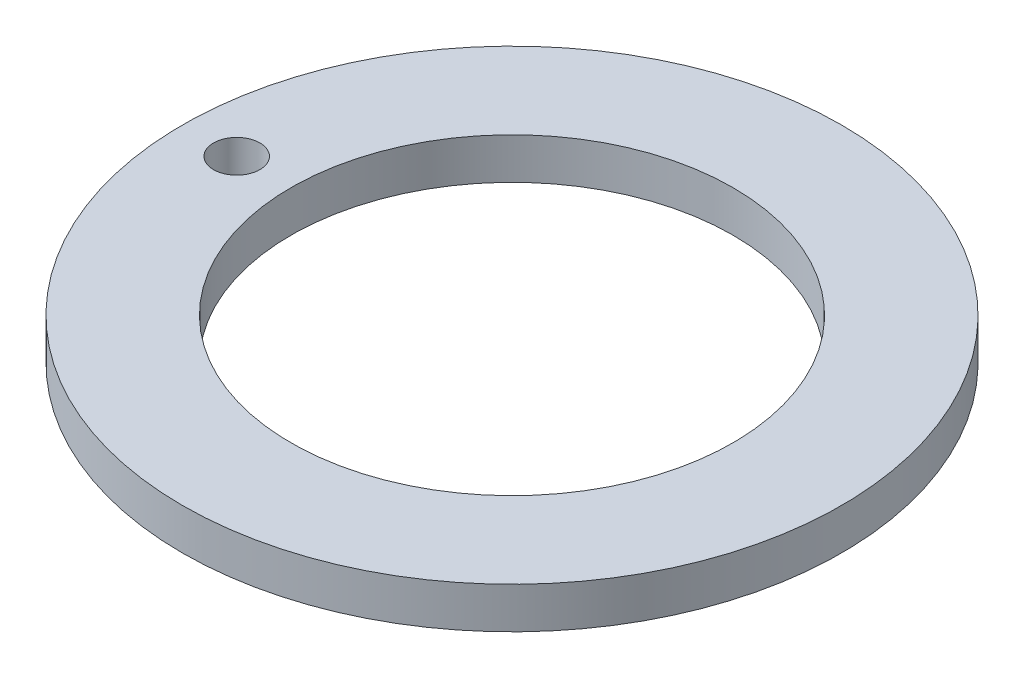
ISO-10303-21;
HEADER;
FILE_DESCRIPTION(('STEP AP214'),'2;1');
FILE_NAME('part.step','',(''),(''),'','','');
FILE_SCHEMA(('AUTOMOTIVE_DESIGN { 1 0 10303 214 1 1 1 1 }'));
ENDSEC;
DATA;
#1=APPLICATION_CONTEXT('core data for automotive mechanical design processes');
#2=APPLICATION_PROTOCOL_DEFINITION('international standard','automotive_design',2000,#1);
#3=PRODUCT_CONTEXT('',#1,'mechanical');
#4=PRODUCT('Part','Part','',(#3));
#5=PRODUCT_RELATED_PRODUCT_CATEGORY('part','',(#4));
#6=PRODUCT_DEFINITION_FORMATION('','',#4);
#7=PRODUCT_DEFINITION_CONTEXT('part definition',#1,'design');
#8=PRODUCT_DEFINITION('design','',#6,#7);
#9=PRODUCT_DEFINITION_SHAPE('','',#8);
#10=(LENGTH_UNIT() NAMED_UNIT(*) SI_UNIT(.MILLI.,.METRE.));
#11=(NAMED_UNIT(*) PLANE_ANGLE_UNIT() SI_UNIT($,.RADIAN.));
#12=(NAMED_UNIT(*) SI_UNIT($,.STERADIAN.) SOLID_ANGLE_UNIT());
#13=UNCERTAINTY_MEASURE_WITH_UNIT(LENGTH_MEASURE(1.E-05),#10,'distance_accuracy_value','');
#14=(GEOMETRIC_REPRESENTATION_CONTEXT(3) GLOBAL_UNCERTAINTY_ASSIGNED_CONTEXT((#13)) GLOBAL_UNIT_ASSIGNED_CONTEXT((#10,
#11,#12)) REPRESENTATION_CONTEXT('',''));
#15=CARTESIAN_POINT('',(0.,0.,0.));
#16=DIRECTION('',(0.,0.,1.));
#17=DIRECTION('',(1.,0.,0.));
#18=AXIS2_PLACEMENT_3D('',#15,#16,#17);
#19=CARTESIAN_POINT('',(0.,9.525,0.));
#20=DIRECTION('',(0.,1.,0.));
#21=DIRECTION('',(0.,0.,1.));
#22=AXIS2_PLACEMENT_3D('',#19,#20,#21);
#23=PLANE('',#22);
#24=CARTESIAN_POINT('',(-63.6524,9.525,0.));
#25=DIRECTION('',(0.,1.,0.));
#26=DIRECTION('',(0.,0.,1.));
#27=AXIS2_PLACEMENT_3D('',#24,#25,#26);
#28=CIRCLE('',#27,5.35813000000001);
#29=CARTESIAN_POINT('',(-63.6524,9.525,5.35813000000001));
#30=VERTEX_POINT('',#29);
#31=EDGE_CURVE('E62',#30,#30,#28,.T.);
#32=ORIENTED_EDGE('',*,*,#31,.F.);
#33=EDGE_LOOP('',(#32));
#34=FACE_BOUND('',#33,.T.);
#35=CARTESIAN_POINT('',(0.,9.525,0.));
#36=DIRECTION('',(0.,1.,0.));
#37=DIRECTION('',(0.,0.,1.));
#38=AXIS2_PLACEMENT_3D('',#35,#36,#37);
#39=CIRCLE('',#38,76.2);
#40=CARTESIAN_POINT('',(0.,9.525,-76.2));
#41=VERTEX_POINT('',#40);
#42=EDGE_CURVE('E10',#41,#41,#39,.T.);
#43=ORIENTED_EDGE('',*,*,#42,.T.);
#44=EDGE_LOOP('',(#43));
#45=FACE_BOUND('',#44,.T.);
#46=CARTESIAN_POINT('',(0.,9.525,0.));
#47=DIRECTION('',(0.,1.,0.));
#48=DIRECTION('',(0.,0.,1.));
#49=AXIS2_PLACEMENT_3D('',#46,#47,#48);
#50=CIRCLE('',#49,51.1048);
#51=CARTESIAN_POINT('',(0.,9.525,-51.1048));
#52=VERTEX_POINT('',#51);
#53=EDGE_CURVE('E54',#52,#52,#50,.T.);
#54=ORIENTED_EDGE('',*,*,#53,.F.);
#55=EDGE_LOOP('',(#54));
#56=FACE_BOUND('',#55,.T.);
#57=ADVANCED_FACE('F43',(#34,#45,#56),#23,.T.);
#58=CARTESIAN_POINT('',(0.,0.,0.));
#59=DIRECTION('',(0.,1.,0.));
#60=DIRECTION('',(0.,0.,1.));
#61=AXIS2_PLACEMENT_3D('',#58,#59,#60);
#62=PLANE('',#61);
#63=CARTESIAN_POINT('',(-63.6524,0.,0.));
#64=DIRECTION('',(0.,1.,0.));
#65=DIRECTION('',(0.,0.,1.));
#66=AXIS2_PLACEMENT_3D('',#63,#64,#65);
#67=CIRCLE('',#66,5.35813000000001);
#68=CARTESIAN_POINT('',(-63.6524,0.,5.35813000000001));
#69=VERTEX_POINT('',#68);
#70=EDGE_CURVE('E59',#69,#69,#67,.T.);
#71=ORIENTED_EDGE('',*,*,#70,.T.);
#72=EDGE_LOOP('',(#71));
#73=FACE_BOUND('',#72,.T.);
#74=CARTESIAN_POINT('',(0.,0.,0.));
#75=DIRECTION('',(0.,1.,0.));
#76=DIRECTION('',(0.,0.,1.));
#77=AXIS2_PLACEMENT_3D('',#74,#75,#76);
#78=CIRCLE('',#77,76.2);
#79=CARTESIAN_POINT('',(0.,0.,-76.2));
#80=VERTEX_POINT('',#79);
#81=EDGE_CURVE('E47',#80,#80,#78,.T.);
#82=ORIENTED_EDGE('',*,*,#81,.F.);
#83=EDGE_LOOP('',(#82));
#84=FACE_BOUND('',#83,.T.);
#85=CARTESIAN_POINT('',(0.,0.,0.));
#86=DIRECTION('',(0.,1.,0.));
#87=DIRECTION('',(0.,0.,1.));
#88=AXIS2_PLACEMENT_3D('',#85,#86,#87);
#89=CIRCLE('',#88,51.1048);
#90=CARTESIAN_POINT('',(0.,0.,-51.1048));
#91=VERTEX_POINT('',#90);
#92=EDGE_CURVE('E56',#91,#91,#89,.T.);
#93=ORIENTED_EDGE('',*,*,#92,.T.);
#94=EDGE_LOOP('',(#93));
#95=FACE_BOUND('',#94,.T.);
#96=ADVANCED_FACE('F68',(#73,#84,#95),#62,.F.);
#97=CARTESIAN_POINT('',(0.,9.525,0.));
#98=DIRECTION('',(0.,-1.,0.));
#99=DIRECTION('',(0.,0.,-1.));
#100=AXIS2_PLACEMENT_3D('',#97,#98,#99);
#101=CYLINDRICAL_SURFACE('',#100,76.2);
#102=CARTESIAN_POINT('',(0.,9.525,-76.2));
#103=CARTESIAN_POINT('',(0.,9.42578125,-76.2));
#104=CARTESIAN_POINT('',(0.,9.3265625,-76.2));
#105=CARTESIAN_POINT('',(0.,9.128125,-76.2));
#106=CARTESIAN_POINT('',(0.,9.02890625,-76.2));
#107=CARTESIAN_POINT('',(0.,8.83046875,-76.2));
#108=CARTESIAN_POINT('',(0.,8.73125,-76.2));
#109=CARTESIAN_POINT('',(0.,8.5328125,-76.2));
#110=CARTESIAN_POINT('',(0.,8.43359375,-76.2));
#111=CARTESIAN_POINT('',(0.,8.23515625,-76.2));
#112=CARTESIAN_POINT('',(0.,8.1359375,-76.2));
#113=CARTESIAN_POINT('',(0.,7.9375,-76.2));
#114=CARTESIAN_POINT('',(0.,7.83828125,-76.2));
#115=CARTESIAN_POINT('',(0.,7.63984375,-76.2));
#116=CARTESIAN_POINT('',(0.,7.540625,-76.2));
#117=CARTESIAN_POINT('',(0.,7.3421875,-76.2));
#118=CARTESIAN_POINT('',(0.,7.24296875,-76.2));
#119=CARTESIAN_POINT('',(0.,7.04453125,-76.2));
#120=CARTESIAN_POINT('',(0.,6.9453125,-76.2));
#121=CARTESIAN_POINT('',(0.,6.746875,-76.2));
#122=CARTESIAN_POINT('',(0.,6.64765625,-76.2));
#123=CARTESIAN_POINT('',(0.,6.44921875,-76.2));
#124=CARTESIAN_POINT('',(0.,6.35,-76.2));
#125=CARTESIAN_POINT('',(0.,6.1515625,-76.2));
#126=CARTESIAN_POINT('',(0.,6.05234375,-76.2));
#127=CARTESIAN_POINT('',(0.,5.85390625,-76.2));
#128=CARTESIAN_POINT('',(0.,5.7546875,-76.2));
#129=CARTESIAN_POINT('',(0.,5.55625,-76.2));
#130=CARTESIAN_POINT('',(0.,5.45703125,-76.2));
#131=CARTESIAN_POINT('',(0.,5.25859375,-76.2));
#132=CARTESIAN_POINT('',(0.,5.159375,-76.2));
#133=CARTESIAN_POINT('',(0.,4.9609375,-76.2));
#134=CARTESIAN_POINT('',(0.,4.86171875,-76.2));
#135=CARTESIAN_POINT('',(0.,4.66328125,-76.2));
#136=CARTESIAN_POINT('',(0.,4.5640625,-76.2));
#137=CARTESIAN_POINT('',(0.,4.365625,-76.2));
#138=CARTESIAN_POINT('',(0.,4.26640625,-76.2));
#139=CARTESIAN_POINT('',(0.,4.06796875,-76.2));
#140=CARTESIAN_POINT('',(0.,3.96875,-76.2));
#141=CARTESIAN_POINT('',(0.,3.7703125,-76.2));
#142=CARTESIAN_POINT('',(0.,3.67109375,-76.2));
#143=CARTESIAN_POINT('',(0.,3.47265625,-76.2));
#144=CARTESIAN_POINT('',(0.,3.3734375,-76.2));
#145=CARTESIAN_POINT('',(0.,3.175,-76.2));
#146=CARTESIAN_POINT('',(0.,3.07578125,-76.2));
#147=CARTESIAN_POINT('',(0.,2.87734375,-76.2));
#148=CARTESIAN_POINT('',(0.,2.778125,-76.2));
#149=CARTESIAN_POINT('',(0.,2.5796875,-76.2));
#150=CARTESIAN_POINT('',(0.,2.48046875,-76.2));
#151=CARTESIAN_POINT('',(0.,2.28203125,-76.2));
#152=CARTESIAN_POINT('',(0.,2.1828125,-76.2));
#153=CARTESIAN_POINT('',(0.,1.984375,-76.2));
#154=CARTESIAN_POINT('',(0.,1.88515625,-76.2));
#155=CARTESIAN_POINT('',(0.,1.68671875,-76.2));
#156=CARTESIAN_POINT('',(0.,1.5875,-76.2));
#157=CARTESIAN_POINT('',(0.,1.3890625,-76.2));
#158=CARTESIAN_POINT('',(0.,1.28984375,-76.2));
#159=CARTESIAN_POINT('',(0.,1.09140625,-76.2));
#160=CARTESIAN_POINT('',(0.,0.992187500000001,-76.2));
#161=CARTESIAN_POINT('',(0.,0.793750000000001,-76.2));
#162=CARTESIAN_POINT('',(0.,0.69453125,-76.2));
#163=CARTESIAN_POINT('',(0.,0.49609375,-76.2));
#164=CARTESIAN_POINT('',(0.,0.396875,-76.2));
#165=CARTESIAN_POINT('',(0.,0.1984375,-76.2));
#166=CARTESIAN_POINT('',(0.,0.0992187500000001,-76.2));
#167=CARTESIAN_POINT('',(0.,0.,-76.2));
#168=B_SPLINE_CURVE_WITH_KNOTS('',3,(#102,#103,#104,#105,#106,#107,#108,#109,#110,#111,#112,
#113,#114,#115,#116,#117,#118,#119,#120,#121,#122,#123,#124,#125,#126,#127,#128,#129,#130,#131,
#132,#133,#134,#135,#136,#137,#138,#139,#140,#141,#142,#143,#144,#145,#146,#147,#148,#149,#150,
#151,#152,#153,#154,#155,#156,#157,#158,#159,#160,#161,#162,#163,#164,#165,#166,#167),
.UNSPECIFIED.,.F.,.F.,(4,2,2,2,2,2,2,2,2,2,2,2,2,2,2,2,2,2,2,2,2,2,2,2,2,2,2,2,2,2,2,2,4),(0.,
0.29765625,0.5953125,0.892968750000001,1.190625,1.48828125,1.7859375,2.08359375,2.38125,
2.67890625,2.9765625,3.27421875,3.571875,3.86953125,4.1671875,4.46484375,4.7625,5.06015625,
5.3578125,5.65546875,5.953125,6.25078125,6.5484375,6.84609375,7.14375,7.44140625,7.7390625,
8.03671875,8.334375,8.63203125,8.9296875,9.22734375,9.525),.UNSPECIFIED.);
#169=EDGE_CURVE('BSEAM45',#41,#80,#168,.T.);
#170=ORIENTED_EDGE('',*,*,#42,.F.);
#171=ORIENTED_EDGE('',*,*,#81,.T.);
#172=ORIENTED_EDGE('',*,*,#169,.T.);
#173=ORIENTED_EDGE('',*,*,#169,.F.);
#174=EDGE_LOOP('',(#170,#172,#171,#173));
#175=FACE_BOUND('',#174,.T.);
#176=ADVANCED_FACE('F45',(#175),#101,.T.);
#177=CARTESIAN_POINT('',(0.,9.525,0.));
#178=DIRECTION('',(0.,-1.,0.));
#179=DIRECTION('',(0.,0.,-1.));
#180=AXIS2_PLACEMENT_3D('',#177,#178,#179);
#181=CYLINDRICAL_SURFACE('',#180,51.1048);
#182=CARTESIAN_POINT('',(0.,9.525,-51.1048));
#183=CARTESIAN_POINT('',(0.,9.42578125,-51.1048));
#184=CARTESIAN_POINT('',(0.,9.3265625,-51.1048));
#185=CARTESIAN_POINT('',(0.,9.128125,-51.1048));
#186=CARTESIAN_POINT('',(0.,9.02890625,-51.1048));
#187=CARTESIAN_POINT('',(0.,8.83046875,-51.1048));
#188=CARTESIAN_POINT('',(0.,8.73125,-51.1048));
#189=CARTESIAN_POINT('',(0.,8.5328125,-51.1048));
#190=CARTESIAN_POINT('',(0.,8.43359375,-51.1048));
#191=CARTESIAN_POINT('',(0.,8.23515625,-51.1048));
#192=CARTESIAN_POINT('',(0.,8.1359375,-51.1048));
#193=CARTESIAN_POINT('',(0.,7.9375,-51.1048));
#194=CARTESIAN_POINT('',(0.,7.83828125,-51.1048));
#195=CARTESIAN_POINT('',(0.,7.63984375,-51.1048));
#196=CARTESIAN_POINT('',(0.,7.540625,-51.1048));
#197=CARTESIAN_POINT('',(0.,7.3421875,-51.1048));
#198=CARTESIAN_POINT('',(0.,7.24296875,-51.1048));
#199=CARTESIAN_POINT('',(0.,7.04453125,-51.1048));
#200=CARTESIAN_POINT('',(0.,6.9453125,-51.1048));
#201=CARTESIAN_POINT('',(0.,6.746875,-51.1048));
#202=CARTESIAN_POINT('',(0.,6.64765625,-51.1048));
#203=CARTESIAN_POINT('',(0.,6.44921875,-51.1048));
#204=CARTESIAN_POINT('',(0.,6.35,-51.1048));
#205=CARTESIAN_POINT('',(0.,6.1515625,-51.1048));
#206=CARTESIAN_POINT('',(0.,6.05234375,-51.1048));
#207=CARTESIAN_POINT('',(0.,5.85390625,-51.1048));
#208=CARTESIAN_POINT('',(0.,5.7546875,-51.1048));
#209=CARTESIAN_POINT('',(0.,5.55625,-51.1048));
#210=CARTESIAN_POINT('',(0.,5.45703125,-51.1048));
#211=CARTESIAN_POINT('',(0.,5.25859375,-51.1048));
#212=CARTESIAN_POINT('',(0.,5.159375,-51.1048));
#213=CARTESIAN_POINT('',(0.,4.9609375,-51.1048));
#214=CARTESIAN_POINT('',(0.,4.86171875,-51.1048));
#215=CARTESIAN_POINT('',(0.,4.66328125,-51.1048));
#216=CARTESIAN_POINT('',(0.,4.5640625,-51.1048));
#217=CARTESIAN_POINT('',(0.,4.365625,-51.1048));
#218=CARTESIAN_POINT('',(0.,4.26640625,-51.1048));
#219=CARTESIAN_POINT('',(0.,4.06796875,-51.1048));
#220=CARTESIAN_POINT('',(0.,3.96875,-51.1048));
#221=CARTESIAN_POINT('',(0.,3.7703125,-51.1048));
#222=CARTESIAN_POINT('',(0.,3.67109375,-51.1048));
#223=CARTESIAN_POINT('',(0.,3.47265625,-51.1048));
#224=CARTESIAN_POINT('',(0.,3.3734375,-51.1048));
#225=CARTESIAN_POINT('',(0.,3.175,-51.1048));
#226=CARTESIAN_POINT('',(0.,3.07578125,-51.1048));
#227=CARTESIAN_POINT('',(0.,2.87734375,-51.1048));
#228=CARTESIAN_POINT('',(0.,2.778125,-51.1048));
#229=CARTESIAN_POINT('',(0.,2.5796875,-51.1048));
#230=CARTESIAN_POINT('',(0.,2.48046875,-51.1048));
#231=CARTESIAN_POINT('',(0.,2.28203125,-51.1048));
#232=CARTESIAN_POINT('',(0.,2.1828125,-51.1048));
#233=CARTESIAN_POINT('',(0.,1.984375,-51.1048));
#234=CARTESIAN_POINT('',(0.,1.88515625,-51.1048));
#235=CARTESIAN_POINT('',(0.,1.68671875,-51.1048));
#236=CARTESIAN_POINT('',(0.,1.5875,-51.1048));
#237=CARTESIAN_POINT('',(0.,1.3890625,-51.1048));
#238=CARTESIAN_POINT('',(0.,1.28984375,-51.1048));
#239=CARTESIAN_POINT('',(0.,1.09140625,-51.1048));
#240=CARTESIAN_POINT('',(0.,0.992187500000001,-51.1048));
#241=CARTESIAN_POINT('',(0.,0.793750000000001,-51.1048));
#242=CARTESIAN_POINT('',(0.,0.69453125,-51.1048));
#243=CARTESIAN_POINT('',(0.,0.49609375,-51.1048));
#244=CARTESIAN_POINT('',(0.,0.396875,-51.1048));
#245=CARTESIAN_POINT('',(0.,0.1984375,-51.1048));
#246=CARTESIAN_POINT('',(0.,0.0992187500000001,-51.1048));
#247=CARTESIAN_POINT('',(0.,0.,-51.1048));
#248=B_SPLINE_CURVE_WITH_KNOTS('',3,(#182,#183,#184,#185,#186,#187,#188,#189,#190,#191,#192,
#193,#194,#195,#196,#197,#198,#199,#200,#201,#202,#203,#204,#205,#206,#207,#208,#209,#210,#211,
#212,#213,#214,#215,#216,#217,#218,#219,#220,#221,#222,#223,#224,#225,#226,#227,#228,#229,#230,
#231,#232,#233,#234,#235,#236,#237,#238,#239,#240,#241,#242,#243,#244,#245,#246,#247),
.UNSPECIFIED.,.F.,.F.,(4,2,2,2,2,2,2,2,2,2,2,2,2,2,2,2,2,2,2,2,2,2,2,2,2,2,2,2,2,2,2,2,4),(0.,
0.297656249999998,0.595312499999999,0.892968749999999,1.190625,1.48828125,1.7859375,2.08359375,
2.38125,2.67890625,2.9765625,3.27421875,3.571875,3.86953125,4.1671875,4.46484375,4.7625,
5.06015625,5.3578125,5.65546875,5.953125,6.25078125,6.5484375,6.84609375,7.14375,7.44140625,
7.7390625,8.03671875,8.334375,8.63203125,8.9296875,9.22734375,9.525),.UNSPECIFIED.);
#249=EDGE_CURVE('BSEAM74',#52,#91,#248,.T.);
#250=ORIENTED_EDGE('',*,*,#53,.T.);
#251=ORIENTED_EDGE('',*,*,#92,.F.);
#252=ORIENTED_EDGE('',*,*,#249,.T.);
#253=ORIENTED_EDGE('',*,*,#249,.F.);
#254=EDGE_LOOP('',(#250,#252,#251,#253));
#255=FACE_BOUND('',#254,.T.);
#256=ADVANCED_FACE('F74',(#255),#181,.F.);
#257=CARTESIAN_POINT('',(-63.6524,0.,0.));
#258=DIRECTION('',(0.,1.,0.));
#259=DIRECTION('',(0.,0.,1.));
#260=AXIS2_PLACEMENT_3D('',#257,#258,#259);
#261=CYLINDRICAL_SURFACE('',#260,5.35813000000001);
#262=CARTESIAN_POINT('',(-63.6524,0.,5.35813000000001));
#263=CARTESIAN_POINT('',(-63.6524,0.0992187499999999,5.35813000000001));
#264=CARTESIAN_POINT('',(-63.6524,0.1984375,5.35813000000001));
#265=CARTESIAN_POINT('',(-63.6524,0.396875,5.35813000000001));
#266=CARTESIAN_POINT('',(-63.6524,0.49609375,5.35813000000001));
#267=CARTESIAN_POINT('',(-63.6524,0.69453125,5.35813000000001));
#268=CARTESIAN_POINT('',(-63.6524,0.79375,5.35813000000001));
#269=CARTESIAN_POINT('',(-63.6524,0.9921875,5.35813000000001));
#270=CARTESIAN_POINT('',(-63.6524,1.09140625,5.35813000000001));
#271=CARTESIAN_POINT('',(-63.6524,1.28984375,5.35813000000001));
#272=CARTESIAN_POINT('',(-63.6524,1.3890625,5.35813000000001));
#273=CARTESIAN_POINT('',(-63.6524,1.5875,5.35813000000001));
#274=CARTESIAN_POINT('',(-63.6524,1.68671875,5.35813000000001));
#275=CARTESIAN_POINT('',(-63.6524,1.88515625,5.35813000000001));
#276=CARTESIAN_POINT('',(-63.6524,1.984375,5.35813000000001));
#277=CARTESIAN_POINT('',(-63.6524,2.1828125,5.35813000000001));
#278=CARTESIAN_POINT('',(-63.6524,2.28203125,5.35813000000001));
#279=CARTESIAN_POINT('',(-63.6524,2.48046875,5.35813000000001));
#280=CARTESIAN_POINT('',(-63.6524,2.5796875,5.35813000000001));
#281=CARTESIAN_POINT('',(-63.6524,2.778125,5.35813000000001));
#282=CARTESIAN_POINT('',(-63.6524,2.87734375,5.35813000000001));
#283=CARTESIAN_POINT('',(-63.6524,3.07578125,5.35813000000001));
#284=CARTESIAN_POINT('',(-63.6524,3.175,5.35813000000001));
#285=CARTESIAN_POINT('',(-63.6524,3.3734375,5.35813000000001));
#286=CARTESIAN_POINT('',(-63.6524,3.47265625,5.35813000000001));
#287=CARTESIAN_POINT('',(-63.6524,3.67109375,5.35813000000001));
#288=CARTESIAN_POINT('',(-63.6524,3.7703125,5.35813000000001));
#289=CARTESIAN_POINT('',(-63.6524,3.96875,5.35813000000001));
#290=CARTESIAN_POINT('',(-63.6524,4.06796875,5.35813000000001));
#291=CARTESIAN_POINT('',(-63.6524,4.26640625,5.35813000000001));
#292=CARTESIAN_POINT('',(-63.6524,4.365625,5.35813000000001));
#293=CARTESIAN_POINT('',(-63.6524,4.5640625,5.35813000000001));
#294=CARTESIAN_POINT('',(-63.6524,4.66328125,5.35813000000001));
#295=CARTESIAN_POINT('',(-63.6524,4.86171875,5.35813000000001));
#296=CARTESIAN_POINT('',(-63.6524,4.9609375,5.35813000000001));
#297=CARTESIAN_POINT('',(-63.6524,5.159375,5.35813000000001));
#298=CARTESIAN_POINT('',(-63.6524,5.25859375,5.35813000000001));
#299=CARTESIAN_POINT('',(-63.6524,5.45703125,5.35813000000001));
#300=CARTESIAN_POINT('',(-63.6524,5.55625,5.35813000000001));
#301=CARTESIAN_POINT('',(-63.6524,5.7546875,5.35813000000001));
#302=CARTESIAN_POINT('',(-63.6524,5.85390625,5.35813000000001));
#303=CARTESIAN_POINT('',(-63.6524,6.05234375,5.35813000000001));
#304=CARTESIAN_POINT('',(-63.6524,6.1515625,5.35813000000001));
#305=CARTESIAN_POINT('',(-63.6524,6.35,5.35813000000001));
#306=CARTESIAN_POINT('',(-63.6524,6.44921875,5.35813000000001));
#307=CARTESIAN_POINT('',(-63.6524,6.64765625,5.35813000000001));
#308=CARTESIAN_POINT('',(-63.6524,6.746875,5.35813000000001));
#309=CARTESIAN_POINT('',(-63.6524,6.9453125,5.35813000000001));
#310=CARTESIAN_POINT('',(-63.6524,7.04453125,5.35813000000001));
#311=CARTESIAN_POINT('',(-63.6524,7.24296875,5.35813000000001));
#312=CARTESIAN_POINT('',(-63.6524,7.3421875,5.35813000000001));
#313=CARTESIAN_POINT('',(-63.6524,7.540625,5.35813000000001));
#314=CARTESIAN_POINT('',(-63.6524,7.63984375,5.35813000000001));
#315=CARTESIAN_POINT('',(-63.6524,7.83828125,5.35813000000001));
#316=CARTESIAN_POINT('',(-63.6524,7.9375,5.35813000000001));
#317=CARTESIAN_POINT('',(-63.6524,8.1359375,5.35813000000001));
#318=CARTESIAN_POINT('',(-63.6524,8.23515625,5.35813000000001));
#319=CARTESIAN_POINT('',(-63.6524,8.43359375,5.35813000000001));
#320=CARTESIAN_POINT('',(-63.6524,8.5328125,5.35813000000001));
#321=CARTESIAN_POINT('',(-63.6524,8.73125,5.35813000000001));
#322=CARTESIAN_POINT('',(-63.6524,8.83046875,5.35813000000001));
#323=CARTESIAN_POINT('',(-63.6524,9.02890625,5.35813000000001));
#324=CARTESIAN_POINT('',(-63.6524,9.128125,5.35813000000001));
#325=CARTESIAN_POINT('',(-63.6524,9.3265625,5.35813000000001));
#326=CARTESIAN_POINT('',(-63.6524,9.42578125,5.35813000000001));
#327=CARTESIAN_POINT('',(-63.6524,9.525,5.35813000000001));
#328=B_SPLINE_CURVE_WITH_KNOTS('',3,(#262,#263,#264,#265,#266,#267,#268,#269,#270,#271,#272,
#273,#274,#275,#276,#277,#278,#279,#280,#281,#282,#283,#284,#285,#286,#287,#288,#289,#290,#291,
#292,#293,#294,#295,#296,#297,#298,#299,#300,#301,#302,#303,#304,#305,#306,#307,#308,#309,#310,
#311,#312,#313,#314,#315,#316,#317,#318,#319,#320,#321,#322,#323,#324,#325,#326,#327),
.UNSPECIFIED.,.F.,.F.,(4,2,2,2,2,2,2,2,2,2,2,2,2,2,2,2,2,2,2,2,2,2,2,2,2,2,2,2,2,2,2,2,4),(0.,
0.29765625,0.5953125,0.89296875,1.190625,1.48828125,1.7859375,2.08359375,2.38125,2.67890625,
2.9765625,3.27421875,3.571875,3.86953125,4.1671875,4.46484375,4.7625,5.06015625,5.3578125,
5.65546875,5.953125,6.25078125,6.5484375,6.84609375,7.14375,7.44140625,7.7390625,8.03671875,
8.334375,8.63203125,8.9296875,9.22734375,9.525),.UNSPECIFIED.);
#329=EDGE_CURVE('BSEAM71',#69,#30,#328,.T.);
#330=ORIENTED_EDGE('',*,*,#70,.F.);
#331=ORIENTED_EDGE('',*,*,#31,.T.);
#332=ORIENTED_EDGE('',*,*,#329,.T.);
#333=ORIENTED_EDGE('',*,*,#329,.F.);
#334=EDGE_LOOP('',(#330,#332,#331,#333));
#335=FACE_BOUND('',#334,.T.);
#336=ADVANCED_FACE('F71',(#335),#261,.F.);
#337=CLOSED_SHELL('',(#57,#96,#176,#256,#336));
#338=MANIFOLD_SOLID_BREP('B2',#337);
#339=ADVANCED_BREP_SHAPE_REPRESENTATION('',(#18,#338),#14);
#340=SHAPE_DEFINITION_REPRESENTATION(#9,#339);
ENDSEC;
END-ISO-10303-21;
